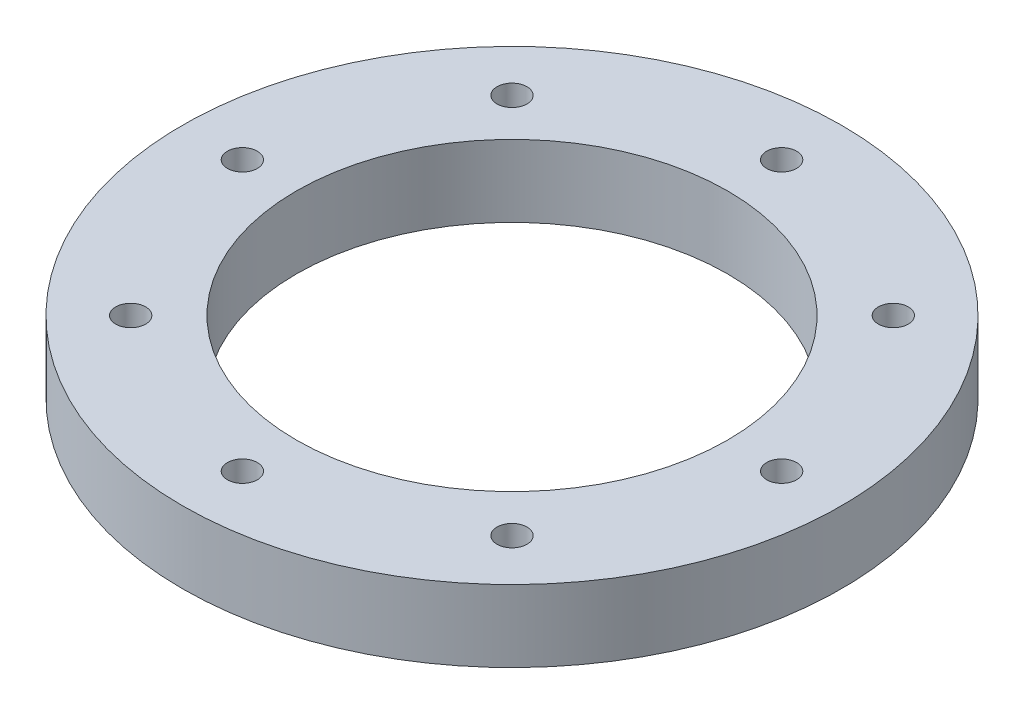
ISO-10303-21;
HEADER;
FILE_DESCRIPTION(('STEP AP214'),'2;1');
FILE_NAME('part.step','',(''),(''),'','','');
FILE_SCHEMA(('AUTOMOTIVE_DESIGN { 1 0 10303 214 1 1 1 1 }'));
ENDSEC;
DATA;
#1=APPLICATION_CONTEXT('core data for automotive mechanical design processes');
#2=APPLICATION_PROTOCOL_DEFINITION('international standard','automotive_design',2000,#1);
#3=PRODUCT_CONTEXT('',#1,'mechanical');
#4=PRODUCT('Part','Part','',(#3));
#5=PRODUCT_RELATED_PRODUCT_CATEGORY('part','',(#4));
#6=PRODUCT_DEFINITION_FORMATION('','',#4);
#7=PRODUCT_DEFINITION_CONTEXT('part definition',#1,'design');
#8=PRODUCT_DEFINITION('design','',#6,#7);
#9=PRODUCT_DEFINITION_SHAPE('','',#8);
#10=(LENGTH_UNIT() NAMED_UNIT(*) SI_UNIT(.MILLI.,.METRE.));
#11=(NAMED_UNIT(*) PLANE_ANGLE_UNIT() SI_UNIT($,.RADIAN.));
#12=(NAMED_UNIT(*) SI_UNIT($,.STERADIAN.) SOLID_ANGLE_UNIT());
#13=UNCERTAINTY_MEASURE_WITH_UNIT(LENGTH_MEASURE(1.E-05),#10,'distance_accuracy_value','');
#14=(GEOMETRIC_REPRESENTATION_CONTEXT(3) GLOBAL_UNCERTAINTY_ASSIGNED_CONTEXT((#13)) GLOBAL_UNIT_ASSIGNED_CONTEXT((#10,
#11,#12)) REPRESENTATION_CONTEXT('',''));
#15=CARTESIAN_POINT('',(0.,0.,0.));
#16=DIRECTION('',(0.,0.,1.));
#17=DIRECTION('',(1.,0.,0.));
#18=AXIS2_PLACEMENT_3D('',#15,#16,#17);
#19=CARTESIAN_POINT('',(31.8198051533946,0.,-31.8198051533947));
#20=DIRECTION('',(0.,1.,0.));
#21=DIRECTION('',(0.,0.,1.));
#22=AXIS2_PLACEMENT_3D('',#19,#20,#21);
#23=CYLINDRICAL_SURFACE('',#22,1.7);
#24=CARTESIAN_POINT('',(31.8198051533946,0.,-31.8198051533947));
#25=DIRECTION('',(0.,1.,0.));
#26=DIRECTION('',(0.707106781186549,0.,0.707106781186546));
#27=AXIS2_PLACEMENT_3D('',#24,#25,#26);
#28=CIRCLE('',#27,1.7);
#29=CARTESIAN_POINT('',(33.0218866814117,0.,-30.6177236253776));
#30=VERTEX_POINT('',#29);
#31=EDGE_CURVE('E116',#30,#30,#28,.T.);
#32=ORIENTED_EDGE('',*,*,#31,.F.);
#33=EDGE_LOOP('',(#32));
#34=FACE_BOUND('',#33,.T.);
#35=CARTESIAN_POINT('',(31.8198051533946,7.,-31.8198051533947));
#36=DIRECTION('',(0.,1.,0.));
#37=DIRECTION('',(0.,0.,1.));
#38=AXIS2_PLACEMENT_3D('',#35,#36,#37);
#39=CIRCLE('',#38,1.7);
#40=CARTESIAN_POINT('',(31.8198051533946,7.,-30.1198051533947));
#41=VERTEX_POINT('',#40);
#42=EDGE_CURVE('E47',#41,#41,#39,.F.);
#43=ORIENTED_EDGE('',*,*,#42,.F.);
#44=EDGE_LOOP('',(#43));
#45=FACE_BOUND('',#44,.T.);
#46=ADVANCED_FACE('F43',(#34,#45),#23,.F.);
#47=CARTESIAN_POINT('',(31.819805153395,0.,31.8198051533942));
#48=DIRECTION('',(0.,1.,0.));
#49=DIRECTION('',(0.,0.,1.));
#50=AXIS2_PLACEMENT_3D('',#47,#48,#49);
#51=CYLINDRICAL_SURFACE('',#50,1.7);
#52=CARTESIAN_POINT('',(31.819805153395,0.,31.8198051533942));
#53=DIRECTION('',(0.,1.,0.));
#54=DIRECTION('',(-0.707106781186539,0.,0.707106781186556));
#55=AXIS2_PLACEMENT_3D('',#52,#53,#54);
#56=CIRCLE('',#55,1.7);
#57=CARTESIAN_POINT('',(30.6177236253779,0.,33.0218866814114));
#58=VERTEX_POINT('',#57);
#59=EDGE_CURVE('E97',#58,#58,#56,.T.);
#60=ORIENTED_EDGE('',*,*,#59,.F.);
#61=EDGE_LOOP('',(#60));
#62=FACE_BOUND('',#61,.T.);
#63=CARTESIAN_POINT('',(31.819805153395,7.,31.8198051533942));
#64=DIRECTION('',(0.,1.,0.));
#65=DIRECTION('',(0.,0.,1.));
#66=AXIS2_PLACEMENT_3D('',#63,#64,#65);
#67=CIRCLE('',#66,1.7);
#68=CARTESIAN_POINT('',(31.819805153395,7.,33.5198051533943));
#69=VERTEX_POINT('',#68);
#70=EDGE_CURVE('E90',#69,#69,#67,.F.);
#71=ORIENTED_EDGE('',*,*,#70,.F.);
#72=EDGE_LOOP('',(#71));
#73=FACE_BOUND('',#72,.T.);
#74=ADVANCED_FACE('F166',(#62,#73),#51,.F.);
#75=CARTESIAN_POINT('',(4.71349980743823E-13,0.,45.));
#76=DIRECTION('',(0.,1.,0.));
#77=DIRECTION('',(0.,0.,1.));
#78=AXIS2_PLACEMENT_3D('',#75,#76,#77);
#79=CYLINDRICAL_SURFACE('',#78,1.7);
#80=CARTESIAN_POINT('',(4.71349980743823E-13,0.,45.));
#81=DIRECTION('',(0.,1.,0.));
#82=DIRECTION('',(-1.,0.,0.));
#83=AXIS2_PLACEMENT_3D('',#80,#81,#82);
#84=CIRCLE('',#83,1.7);
#85=CARTESIAN_POINT('',(-1.69999999999953,0.,45.));
#86=VERTEX_POINT('',#85);
#87=EDGE_CURVE('E102',#86,#86,#84,.T.);
#88=ORIENTED_EDGE('',*,*,#87,.F.);
#89=EDGE_LOOP('',(#88));
#90=FACE_BOUND('',#89,.T.);
#91=CARTESIAN_POINT('',(4.71349980743823E-13,7.,45.));
#92=DIRECTION('',(0.,1.,0.));
#93=DIRECTION('',(0.,0.,1.));
#94=AXIS2_PLACEMENT_3D('',#91,#92,#93);
#95=CIRCLE('',#94,1.7);
#96=CARTESIAN_POINT('',(4.71349980743823E-13,7.,46.7));
#97=VERTEX_POINT('',#96);
#98=EDGE_CURVE('E87',#97,#97,#95,.F.);
#99=ORIENTED_EDGE('',*,*,#98,.F.);
#100=EDGE_LOOP('',(#99));
#101=FACE_BOUND('',#100,.T.);
#102=ADVANCED_FACE('F173',(#90,#101),#79,.F.);
#103=CARTESIAN_POINT('',(-31.8198051533944,0.,31.8198051533949));
#104=DIRECTION('',(0.,1.,0.));
#105=DIRECTION('',(0.,0.,1.));
#106=AXIS2_PLACEMENT_3D('',#103,#104,#105);
#107=CYLINDRICAL_SURFACE('',#106,1.7);
#108=CARTESIAN_POINT('',(-31.8198051533944,0.,31.8198051533949));
#109=DIRECTION('',(0.,1.,0.));
#110=DIRECTION('',(-0.707106781186554,0.,-0.707106781186541));
#111=AXIS2_PLACEMENT_3D('',#108,#109,#110);
#112=CIRCLE('',#111,1.7);
#113=CARTESIAN_POINT('',(-33.0218866814115,0.,30.6177236253778));
#114=VERTEX_POINT('',#113);
#115=EDGE_CURVE('E108',#114,#114,#112,.T.);
#116=ORIENTED_EDGE('',*,*,#115,.F.);
#117=EDGE_LOOP('',(#116));
#118=FACE_BOUND('',#117,.T.);
#119=CARTESIAN_POINT('',(-31.8198051533944,7.,31.8198051533949));
#120=DIRECTION('',(0.,1.,0.));
#121=DIRECTION('',(0.,0.,1.));
#122=AXIS2_PLACEMENT_3D('',#119,#120,#121);
#123=CIRCLE('',#122,1.7);
#124=CARTESIAN_POINT('',(-31.8198051533944,7.,33.5198051533949));
#125=VERTEX_POINT('',#124);
#126=EDGE_CURVE('E83',#125,#125,#123,.F.);
#127=ORIENTED_EDGE('',*,*,#126,.F.);
#128=EDGE_LOOP('',(#127));
#129=FACE_BOUND('',#128,.T.);
#130=ADVANCED_FACE('F179',(#118,#129),#107,.F.);
#131=CARTESIAN_POINT('',(-45.,0.,0.));
#132=DIRECTION('',(0.,1.,0.));
#133=DIRECTION('',(0.,0.,1.));
#134=AXIS2_PLACEMENT_3D('',#131,#132,#133);
#135=CYLINDRICAL_SURFACE('',#134,1.7);
#136=CARTESIAN_POINT('',(-45.,0.,0.));
#137=DIRECTION('',(0.,1.,0.));
#138=DIRECTION('',(0.,0.,-1.));
#139=AXIS2_PLACEMENT_3D('',#136,#137,#138);
#140=CIRCLE('',#139,1.7);
#141=CARTESIAN_POINT('',(-45.,0.,-1.7));
#142=VERTEX_POINT('',#141);
#143=EDGE_CURVE('E121',#142,#142,#140,.T.);
#144=ORIENTED_EDGE('',*,*,#143,.F.);
#145=EDGE_LOOP('',(#144));
#146=FACE_BOUND('',#145,.T.);
#147=CARTESIAN_POINT('',(-45.,7.,0.));
#148=DIRECTION('',(0.,1.,0.));
#149=DIRECTION('',(0.,0.,1.));
#150=AXIS2_PLACEMENT_3D('',#147,#148,#149);
#151=CIRCLE('',#150,1.7);
#152=CARTESIAN_POINT('',(-45.,7.,1.7));
#153=VERTEX_POINT('',#152);
#154=EDGE_CURVE('E79',#153,#153,#151,.F.);
#155=ORIENTED_EDGE('',*,*,#154,.F.);
#156=EDGE_LOOP('',(#155));
#157=FACE_BOUND('',#156,.T.);
#158=ADVANCED_FACE('F284',(#146,#157),#135,.F.);
#159=CARTESIAN_POINT('',(-31.8198051533948,0.,-31.8198051533945));
#160=DIRECTION('',(0.,1.,0.));
#161=DIRECTION('',(0.,0.,1.));
#162=AXIS2_PLACEMENT_3D('',#159,#160,#161);
#163=CYLINDRICAL_SURFACE('',#162,1.7);
#164=CARTESIAN_POINT('',(-31.8198051533948,0.,-31.8198051533945));
#165=DIRECTION('',(0.,1.,0.));
#166=DIRECTION('',(0.707106781186544,0.,-0.707106781186551));
#167=AXIS2_PLACEMENT_3D('',#164,#165,#166);
#168=CIRCLE('',#167,1.7);
#169=CARTESIAN_POINT('',(-30.6177236253777,0.,-33.0218866814116));
#170=VERTEX_POINT('',#169);
#171=EDGE_CURVE('E117',#170,#170,#168,.T.);
#172=ORIENTED_EDGE('',*,*,#171,.F.);
#173=EDGE_LOOP('',(#172));
#174=FACE_BOUND('',#173,.T.);
#175=CARTESIAN_POINT('',(-31.8198051533948,7.,-31.8198051533945));
#176=DIRECTION('',(0.,1.,0.));
#177=DIRECTION('',(0.,0.,1.));
#178=AXIS2_PLACEMENT_3D('',#175,#176,#177);
#179=CIRCLE('',#178,1.7);
#180=CARTESIAN_POINT('',(-31.8198051533948,7.,-30.1198051533945));
#181=VERTEX_POINT('',#180);
#182=EDGE_CURVE('E74',#181,#181,#179,.F.);
#183=ORIENTED_EDGE('',*,*,#182,.F.);
#184=EDGE_LOOP('',(#183));
#185=FACE_BOUND('',#184,.T.);
#186=ADVANCED_FACE('F193',(#174,#185),#163,.F.);
#187=CARTESIAN_POINT('',(-1.57116660247941E-13,0.,-45.));
#188=DIRECTION('',(0.,1.,0.));
#189=DIRECTION('',(0.,0.,1.));
#190=AXIS2_PLACEMENT_3D('',#187,#188,#189);
#191=CYLINDRICAL_SURFACE('',#190,1.7);
#192=CARTESIAN_POINT('',(-1.57116660247941E-13,0.,-45.));
#193=DIRECTION('',(0.,1.,0.));
#194=DIRECTION('',(1.,0.,0.));
#195=AXIS2_PLACEMENT_3D('',#192,#193,#194);
#196=CIRCLE('',#195,1.7);
#197=CARTESIAN_POINT('',(1.69999999999984,0.,-45.));
#198=VERTEX_POINT('',#197);
#199=EDGE_CURVE('E112',#198,#198,#196,.T.);
#200=ORIENTED_EDGE('',*,*,#199,.F.);
#201=EDGE_LOOP('',(#200));
#202=FACE_BOUND('',#201,.T.);
#203=CARTESIAN_POINT('',(-1.57116660247941E-13,7.,-45.));
#204=DIRECTION('',(0.,1.,0.));
#205=DIRECTION('',(0.,0.,1.));
#206=AXIS2_PLACEMENT_3D('',#203,#204,#205);
#207=CIRCLE('',#206,1.7);
#208=CARTESIAN_POINT('',(-1.57116660247941E-13,7.,-43.3));
#209=VERTEX_POINT('',#208);
#210=EDGE_CURVE('E70',#209,#209,#207,.F.);
#211=ORIENTED_EDGE('',*,*,#210,.F.);
#212=EDGE_LOOP('',(#211));
#213=FACE_BOUND('',#212,.T.);
#214=ADVANCED_FACE('F186',(#202,#213),#191,.F.);
#215=CARTESIAN_POINT('',(45.,0.,0.));
#216=DIRECTION('',(0.,1.,0.));
#217=DIRECTION('',(0.,0.,1.));
#218=AXIS2_PLACEMENT_3D('',#215,#216,#217);
#219=CYLINDRICAL_SURFACE('',#218,1.7);
#220=CARTESIAN_POINT('',(45.,0.,0.));
#221=DIRECTION('',(0.,1.,0.));
#222=DIRECTION('',(0.,0.,1.));
#223=AXIS2_PLACEMENT_3D('',#220,#221,#222);
#224=CIRCLE('',#223,1.7);
#225=CARTESIAN_POINT('',(45.,0.,1.7));
#226=VERTEX_POINT('',#225);
#227=EDGE_CURVE('E68',#226,#226,#224,.T.);
#228=ORIENTED_EDGE('',*,*,#227,.F.);
#229=EDGE_LOOP('',(#228));
#230=FACE_BOUND('',#229,.T.);
#231=CARTESIAN_POINT('',(45.,7.,0.));
#232=DIRECTION('',(0.,1.,0.));
#233=DIRECTION('',(0.,0.,1.));
#234=AXIS2_PLACEMENT_3D('',#231,#232,#233);
#235=CIRCLE('',#234,1.7);
#236=CARTESIAN_POINT('',(45.,7.,1.7));
#237=VERTEX_POINT('',#236);
#238=EDGE_CURVE('E64',#237,#237,#235,.F.);
#239=ORIENTED_EDGE('',*,*,#238,.F.);
#240=EDGE_LOOP('',(#239));
#241=FACE_BOUND('',#240,.T.);
#242=ADVANCED_FACE('F184',(#230,#241),#219,.F.);
#243=CARTESIAN_POINT('',(0.,12.,0.));
#244=DIRECTION('',(0.,1.,0.));
#245=DIRECTION('',(0.,0.,1.));
#246=AXIS2_PLACEMENT_3D('',#243,#244,#245);
#247=PLANE('',#246);
#248=CARTESIAN_POINT('',(-1.57116660247941E-13,12.,-45.));
#249=DIRECTION('',(0.,1.,0.));
#250=DIRECTION('',(1.,0.,0.));
#251=AXIS2_PLACEMENT_3D('',#248,#249,#250);
#252=CIRCLE('',#251,2.5);
#253=CARTESIAN_POINT('',(2.49999999999985,12.,-45.));
#254=VERTEX_POINT('',#253);
#255=EDGE_CURVE('E470',#254,#254,#252,.T.);
#256=ORIENTED_EDGE('',*,*,#255,.F.);
#257=EDGE_LOOP('',(#256));
#258=FACE_BOUND('',#257,.T.);
#259=CARTESIAN_POINT('',(-31.8198051533948,12.,-31.8198051533945));
#260=DIRECTION('',(0.,1.,0.));
#261=DIRECTION('',(0.707106781186544,0.,-0.707106781186551));
#262=AXIS2_PLACEMENT_3D('',#259,#260,#261);
#263=CIRCLE('',#262,2.5);
#264=CARTESIAN_POINT('',(-30.0520382004284,12.,-33.5875721063608));
#265=VERTEX_POINT('',#264);
#266=EDGE_CURVE('E490',#265,#265,#263,.T.);
#267=ORIENTED_EDGE('',*,*,#266,.F.);
#268=EDGE_LOOP('',(#267));
#269=FACE_BOUND('',#268,.T.);
#270=CARTESIAN_POINT('',(-45.,12.,0.));
#271=DIRECTION('',(0.,1.,0.));
#272=DIRECTION('',(0.,0.,-1.));
#273=AXIS2_PLACEMENT_3D('',#270,#271,#272);
#274=CIRCLE('',#273,2.5);
#275=CARTESIAN_POINT('',(-45.,12.,-2.5));
#276=VERTEX_POINT('',#275);
#277=EDGE_CURVE('E482',#276,#276,#274,.T.);
#278=ORIENTED_EDGE('',*,*,#277,.F.);
#279=EDGE_LOOP('',(#278));
#280=FACE_BOUND('',#279,.T.);
#281=CARTESIAN_POINT('',(-31.8198051533944,12.,31.8198051533949));
#282=DIRECTION('',(0.,1.,0.));
#283=DIRECTION('',(-0.707106781186554,0.,-0.707106781186541));
#284=AXIS2_PLACEMENT_3D('',#281,#282,#283);
#285=CIRCLE('',#284,2.5);
#286=CARTESIAN_POINT('',(-33.5875721063607,12.,30.0520382004286));
#287=VERTEX_POINT('',#286);
#288=EDGE_CURVE('E473',#287,#287,#285,.T.);
#289=ORIENTED_EDGE('',*,*,#288,.F.);
#290=EDGE_LOOP('',(#289));
#291=FACE_BOUND('',#290,.T.);
#292=CARTESIAN_POINT('',(4.71349980743823E-13,12.,45.));
#293=DIRECTION('',(0.,1.,0.));
#294=DIRECTION('',(-1.,0.,0.));
#295=AXIS2_PLACEMENT_3D('',#292,#293,#294);
#296=CIRCLE('',#295,2.5);
#297=CARTESIAN_POINT('',(-2.49999999999953,12.,45.));
#298=VERTEX_POINT('',#297);
#299=EDGE_CURVE('E509',#298,#298,#296,.T.);
#300=ORIENTED_EDGE('',*,*,#299,.F.);
#301=EDGE_LOOP('',(#300));
#302=FACE_BOUND('',#301,.T.);
#303=CARTESIAN_POINT('',(31.819805153395,12.,31.8198051533942));
#304=DIRECTION('',(0.,1.,0.));
#305=DIRECTION('',(-0.707106781186539,0.,0.707106781186556));
#306=AXIS2_PLACEMENT_3D('',#303,#304,#305);
#307=CIRCLE('',#306,2.5);
#308=CARTESIAN_POINT('',(30.0520382004287,12.,33.5875721063606));
#309=VERTEX_POINT('',#308);
#310=EDGE_CURVE('E501',#309,#309,#307,.T.);
#311=ORIENTED_EDGE('',*,*,#310,.F.);
#312=EDGE_LOOP('',(#311));
#313=FACE_BOUND('',#312,.T.);
#314=CARTESIAN_POINT('',(31.8198051533946,12.,-31.8198051533947));
#315=DIRECTION('',(0.,1.,0.));
#316=DIRECTION('',(0.707106781186549,0.,0.707106781186546));
#317=AXIS2_PLACEMENT_3D('',#314,#315,#316);
#318=CIRCLE('',#317,2.5);
#319=CARTESIAN_POINT('',(33.587572106361,12.,-30.0520382004283));
#320=VERTEX_POINT('',#319);
#321=EDGE_CURVE('E462',#320,#320,#318,.T.);
#322=ORIENTED_EDGE('',*,*,#321,.F.);
#323=EDGE_LOOP('',(#322));
#324=FACE_BOUND('',#323,.T.);
#325=CARTESIAN_POINT('',(45.,12.,0.));
#326=DIRECTION('',(0.,1.,0.));
#327=DIRECTION('',(0.,0.,1.));
#328=AXIS2_PLACEMENT_3D('',#325,#326,#327);
#329=CIRCLE('',#328,2.5);
#330=CARTESIAN_POINT('',(45.,12.,2.5));
#331=VERTEX_POINT('',#330);
#332=EDGE_CURVE('E131',#331,#331,#329,.T.);
#333=ORIENTED_EDGE('',*,*,#332,.F.);
#334=EDGE_LOOP('',(#333));
#335=FACE_BOUND('',#334,.T.);
#336=CARTESIAN_POINT('',(0.,12.,0.));
#337=DIRECTION('',(0.,1.,0.));
#338=DIRECTION('',(0.,0.,1.));
#339=AXIS2_PLACEMENT_3D('',#336,#337,#338);
#340=CIRCLE('',#339,55.);
#341=CARTESIAN_POINT('',(0.,12.,55.));
#342=VERTEX_POINT('',#341);
#343=EDGE_CURVE('E10',#342,#342,#340,.T.);
#344=ORIENTED_EDGE('',*,*,#343,.T.);
#345=EDGE_LOOP('',(#344));
#346=FACE_BOUND('',#345,.T.);
#347=CARTESIAN_POINT('',(0.,12.,0.));
#348=DIRECTION('',(0.,1.,0.));
#349=DIRECTION('',(0.,0.,1.));
#350=AXIS2_PLACEMENT_3D('',#347,#348,#349);
#351=CIRCLE('',#350,36.);
#352=CARTESIAN_POINT('',(0.,12.,36.));
#353=VERTEX_POINT('',#352);
#354=EDGE_CURVE('E58',#353,#353,#351,.T.);
#355=ORIENTED_EDGE('',*,*,#354,.F.);
#356=EDGE_LOOP('',(#355));
#357=FACE_BOUND('',#356,.T.);
#358=ADVANCED_FACE('F185',(#258,#269,#280,#291,#302,#313,#324,#335,#346,#357),#247,.T.);
#359=CARTESIAN_POINT('',(0.,0.,0.));
#360=DIRECTION('',(0.,1.,0.));
#361=DIRECTION('',(0.,0.,1.));
#362=AXIS2_PLACEMENT_3D('',#359,#360,#361);
#363=PLANE('',#362);
#364=ORIENTED_EDGE('',*,*,#199,.T.);
#365=EDGE_LOOP('',(#364));
#366=FACE_BOUND('',#365,.T.);
#367=ORIENTED_EDGE('',*,*,#171,.T.);
#368=EDGE_LOOP('',(#367));
#369=FACE_BOUND('',#368,.T.);
#370=ORIENTED_EDGE('',*,*,#143,.T.);
#371=EDGE_LOOP('',(#370));
#372=FACE_BOUND('',#371,.T.);
#373=ORIENTED_EDGE('',*,*,#115,.T.);
#374=EDGE_LOOP('',(#373));
#375=FACE_BOUND('',#374,.T.);
#376=ORIENTED_EDGE('',*,*,#87,.T.);
#377=EDGE_LOOP('',(#376));
#378=FACE_BOUND('',#377,.T.);
#379=ORIENTED_EDGE('',*,*,#59,.T.);
#380=EDGE_LOOP('',(#379));
#381=FACE_BOUND('',#380,.T.);
#382=ORIENTED_EDGE('',*,*,#31,.T.);
#383=EDGE_LOOP('',(#382));
#384=FACE_BOUND('',#383,.T.);
#385=ORIENTED_EDGE('',*,*,#227,.T.);
#386=EDGE_LOOP('',(#385));
#387=FACE_BOUND('',#386,.T.);
#388=CARTESIAN_POINT('',(0.,0.,0.));
#389=DIRECTION('',(0.,1.,0.));
#390=DIRECTION('',(0.,0.,1.));
#391=AXIS2_PLACEMENT_3D('',#388,#389,#390);
#392=CIRCLE('',#391,55.);
#393=CARTESIAN_POINT('',(0.,0.,55.));
#394=VERTEX_POINT('',#393);
#395=EDGE_CURVE('E52',#394,#394,#392,.T.);
#396=ORIENTED_EDGE('',*,*,#395,.F.);
#397=EDGE_LOOP('',(#396));
#398=FACE_BOUND('',#397,.T.);
#399=CARTESIAN_POINT('',(0.,0.,0.));
#400=DIRECTION('',(0.,1.,0.));
#401=DIRECTION('',(0.,0.,1.));
#402=AXIS2_PLACEMENT_3D('',#399,#400,#401);
#403=CIRCLE('',#402,36.);
#404=CARTESIAN_POINT('',(0.,0.,36.));
#405=VERTEX_POINT('',#404);
#406=EDGE_CURVE('E61',#405,#405,#403,.T.);
#407=ORIENTED_EDGE('',*,*,#406,.T.);
#408=EDGE_LOOP('',(#407));
#409=FACE_BOUND('',#408,.T.);
#410=ADVANCED_FACE('F148',(#366,#369,#372,#375,#378,#381,#384,#387,#398,#409),#363,.F.);
#411=CARTESIAN_POINT('',(0.,12.,0.));
#412=DIRECTION('',(0.,-1.,0.));
#413=DIRECTION('',(0.,0.,-1.));
#414=AXIS2_PLACEMENT_3D('',#411,#412,#413);
#415=CYLINDRICAL_SURFACE('',#414,55.);
#416=ORIENTED_EDGE('',*,*,#343,.F.);
#417=EDGE_LOOP('',(#416));
#418=FACE_BOUND('',#417,.T.);
#419=ORIENTED_EDGE('',*,*,#395,.T.);
#420=EDGE_LOOP('',(#419));
#421=FACE_BOUND('',#420,.T.);
#422=ADVANCED_FACE('F45',(#418,#421),#415,.T.);
#423=CARTESIAN_POINT('',(0.,12.,0.));
#424=DIRECTION('',(0.,-1.,0.));
#425=DIRECTION('',(0.,0.,-1.));
#426=AXIS2_PLACEMENT_3D('',#423,#424,#425);
#427=CYLINDRICAL_SURFACE('',#426,36.);
#428=ORIENTED_EDGE('',*,*,#354,.T.);
#429=EDGE_LOOP('',(#428));
#430=FACE_BOUND('',#429,.T.);
#431=ORIENTED_EDGE('',*,*,#406,.F.);
#432=EDGE_LOOP('',(#431));
#433=FACE_BOUND('',#432,.T.);
#434=ADVANCED_FACE('F150',(#430,#433),#427,.F.);
#435=CARTESIAN_POINT('',(45.,7.,0.));
#436=DIRECTION('',(0.,1.,0.));
#437=DIRECTION('',(0.,0.,1.));
#438=AXIS2_PLACEMENT_3D('',#435,#436,#437);
#439=PLANE('',#438);
#440=CARTESIAN_POINT('',(45.,7.,0.));
#441=DIRECTION('',(0.,1.,0.));
#442=DIRECTION('',(0.,0.,1.));
#443=AXIS2_PLACEMENT_3D('',#440,#441,#442);
#444=CIRCLE('',#443,2.5);
#445=CARTESIAN_POINT('',(45.,7.,2.5));
#446=VERTEX_POINT('',#445);
#447=EDGE_CURVE('E69',#446,#446,#444,.T.);
#448=ORIENTED_EDGE('',*,*,#447,.T.);
#449=EDGE_LOOP('',(#448));
#450=FACE_BOUND('',#449,.T.);
#451=ORIENTED_EDGE('',*,*,#238,.T.);
#452=EDGE_LOOP('',(#451));
#453=FACE_BOUND('',#452,.T.);
#454=ADVANCED_FACE('F152',(#450,#453),#439,.T.);
#455=CARTESIAN_POINT('',(45.,7.,0.));
#456=DIRECTION('',(0.,1.,0.));
#457=DIRECTION('',(0.,0.,1.));
#458=AXIS2_PLACEMENT_3D('',#455,#456,#457);
#459=CYLINDRICAL_SURFACE('',#458,2.5);
#460=ORIENTED_EDGE('',*,*,#447,.F.);
#461=EDGE_LOOP('',(#460));
#462=FACE_BOUND('',#461,.T.);
#463=ORIENTED_EDGE('',*,*,#332,.T.);
#464=EDGE_LOOP('',(#463));
#465=FACE_BOUND('',#464,.T.);
#466=ADVANCED_FACE('F159',(#462,#465),#459,.F.);
#467=CARTESIAN_POINT('',(-1.57116660247941E-13,7.,-45.));
#468=DIRECTION('',(0.,1.,0.));
#469=DIRECTION('',(1.,0.,0.));
#470=AXIS2_PLACEMENT_3D('',#467,#468,#469);
#471=PLANE('',#470);
#472=CARTESIAN_POINT('',(-1.57116660247941E-13,7.,-45.));
#473=DIRECTION('',(0.,1.,0.));
#474=DIRECTION('',(1.,0.,0.));
#475=AXIS2_PLACEMENT_3D('',#472,#473,#474);
#476=CIRCLE('',#475,2.5);
#477=CARTESIAN_POINT('',(2.49999999999985,7.,-45.));
#478=VERTEX_POINT('',#477);
#479=EDGE_CURVE('E465',#478,#478,#476,.T.);
#480=ORIENTED_EDGE('',*,*,#479,.T.);
#481=EDGE_LOOP('',(#480));
#482=FACE_BOUND('',#481,.T.);
#483=ORIENTED_EDGE('',*,*,#210,.T.);
#484=EDGE_LOOP('',(#483));
#485=FACE_BOUND('',#484,.T.);
#486=ADVANCED_FACE('F182',(#482,#485),#471,.T.);
#487=CARTESIAN_POINT('',(-1.57116660247941E-13,7.,-45.));
#488=DIRECTION('',(0.,1.,0.));
#489=DIRECTION('',(0.,0.,1.));
#490=AXIS2_PLACEMENT_3D('',#487,#488,#489);
#491=CYLINDRICAL_SURFACE('',#490,2.5);
#492=ORIENTED_EDGE('',*,*,#479,.F.);
#493=EDGE_LOOP('',(#492));
#494=FACE_BOUND('',#493,.T.);
#495=ORIENTED_EDGE('',*,*,#255,.T.);
#496=EDGE_LOOP('',(#495));
#497=FACE_BOUND('',#496,.T.);
#498=ADVANCED_FACE('F252',(#494,#497),#491,.F.);
#499=CARTESIAN_POINT('',(-31.8198051533948,7.,-31.8198051533945));
#500=DIRECTION('',(0.,1.,0.));
#501=DIRECTION('',(0.707106781186544,0.,-0.707106781186551));
#502=AXIS2_PLACEMENT_3D('',#499,#500,#501);
#503=PLANE('',#502);
#504=CARTESIAN_POINT('',(-31.8198051533948,7.,-31.8198051533945));
#505=DIRECTION('',(0.,1.,0.));
#506=DIRECTION('',(0.707106781186544,0.,-0.707106781186551));
#507=AXIS2_PLACEMENT_3D('',#504,#505,#506);
#508=CIRCLE('',#507,2.5);
#509=CARTESIAN_POINT('',(-30.0520382004284,7.,-33.5875721063608));
#510=VERTEX_POINT('',#509);
#511=EDGE_CURVE('E494',#510,#510,#508,.T.);
#512=ORIENTED_EDGE('',*,*,#511,.T.);
#513=EDGE_LOOP('',(#512));
#514=FACE_BOUND('',#513,.T.);
#515=ORIENTED_EDGE('',*,*,#182,.T.);
#516=EDGE_LOOP('',(#515));
#517=FACE_BOUND('',#516,.T.);
#518=ADVANCED_FACE('F256',(#514,#517),#503,.T.);
#519=CARTESIAN_POINT('',(-31.8198051533948,7.,-31.8198051533945));
#520=DIRECTION('',(0.,1.,0.));
#521=DIRECTION('',(0.,0.,1.));
#522=AXIS2_PLACEMENT_3D('',#519,#520,#521);
#523=CYLINDRICAL_SURFACE('',#522,2.5);
#524=ORIENTED_EDGE('',*,*,#511,.F.);
#525=EDGE_LOOP('',(#524));
#526=FACE_BOUND('',#525,.T.);
#527=ORIENTED_EDGE('',*,*,#266,.T.);
#528=EDGE_LOOP('',(#527));
#529=FACE_BOUND('',#528,.T.);
#530=ADVANCED_FACE('F260',(#526,#529),#523,.F.);
#531=CARTESIAN_POINT('',(-45.,7.,0.));
#532=DIRECTION('',(0.,1.,0.));
#533=DIRECTION('',(0.,0.,-1.));
#534=AXIS2_PLACEMENT_3D('',#531,#532,#533);
#535=PLANE('',#534);
#536=CARTESIAN_POINT('',(-45.,7.,0.));
#537=DIRECTION('',(0.,1.,0.));
#538=DIRECTION('',(0.,0.,-1.));
#539=AXIS2_PLACEMENT_3D('',#536,#537,#538);
#540=CIRCLE('',#539,2.5);
#541=CARTESIAN_POINT('',(-45.,7.,-2.5));
#542=VERTEX_POINT('',#541);
#543=EDGE_CURVE('E486',#542,#542,#540,.T.);
#544=ORIENTED_EDGE('',*,*,#543,.T.);
#545=EDGE_LOOP('',(#544));
#546=FACE_BOUND('',#545,.T.);
#547=ORIENTED_EDGE('',*,*,#154,.T.);
#548=EDGE_LOOP('',(#547));
#549=FACE_BOUND('',#548,.T.);
#550=ADVANCED_FACE('F264',(#546,#549),#535,.T.);
#551=CARTESIAN_POINT('',(-45.,7.,0.));
#552=DIRECTION('',(0.,1.,0.));
#553=DIRECTION('',(0.,0.,1.));
#554=AXIS2_PLACEMENT_3D('',#551,#552,#553);
#555=CYLINDRICAL_SURFACE('',#554,2.5);
#556=ORIENTED_EDGE('',*,*,#543,.F.);
#557=EDGE_LOOP('',(#556));
#558=FACE_BOUND('',#557,.T.);
#559=ORIENTED_EDGE('',*,*,#277,.T.);
#560=EDGE_LOOP('',(#559));
#561=FACE_BOUND('',#560,.T.);
#562=ADVANCED_FACE('F268',(#558,#561),#555,.F.);
#563=CARTESIAN_POINT('',(-31.8198051533944,7.,31.8198051533949));
#564=DIRECTION('',(0.,1.,0.));
#565=DIRECTION('',(-0.707106781186554,0.,-0.707106781186541));
#566=AXIS2_PLACEMENT_3D('',#563,#564,#565);
#567=PLANE('',#566);
#568=CARTESIAN_POINT('',(-31.8198051533944,7.,31.8198051533949));
#569=DIRECTION('',(0.,1.,0.));
#570=DIRECTION('',(-0.707106781186554,0.,-0.707106781186541));
#571=AXIS2_PLACEMENT_3D('',#568,#569,#570);
#572=CIRCLE('',#571,2.5);
#573=CARTESIAN_POINT('',(-33.5875721063607,7.,30.0520382004286));
#574=VERTEX_POINT('',#573);
#575=EDGE_CURVE('E477',#574,#574,#572,.T.);
#576=ORIENTED_EDGE('',*,*,#575,.T.);
#577=EDGE_LOOP('',(#576));
#578=FACE_BOUND('',#577,.T.);
#579=ORIENTED_EDGE('',*,*,#126,.T.);
#580=EDGE_LOOP('',(#579));
#581=FACE_BOUND('',#580,.T.);
#582=ADVANCED_FACE('F238',(#578,#581),#567,.T.);
#583=CARTESIAN_POINT('',(-31.8198051533944,7.,31.8198051533949));
#584=DIRECTION('',(0.,1.,0.));
#585=DIRECTION('',(0.,0.,1.));
#586=AXIS2_PLACEMENT_3D('',#583,#584,#585);
#587=CYLINDRICAL_SURFACE('',#586,2.5);
#588=ORIENTED_EDGE('',*,*,#575,.F.);
#589=EDGE_LOOP('',(#588));
#590=FACE_BOUND('',#589,.T.);
#591=ORIENTED_EDGE('',*,*,#288,.T.);
#592=EDGE_LOOP('',(#591));
#593=FACE_BOUND('',#592,.T.);
#594=ADVANCED_FACE('F228',(#590,#593),#587,.F.);
#595=CARTESIAN_POINT('',(4.71349980743823E-13,7.,45.));
#596=DIRECTION('',(0.,1.,0.));
#597=DIRECTION('',(-1.,0.,0.));
#598=AXIS2_PLACEMENT_3D('',#595,#596,#597);
#599=PLANE('',#598);
#600=CARTESIAN_POINT('',(4.71349980743823E-13,7.,45.));
#601=DIRECTION('',(0.,1.,0.));
#602=DIRECTION('',(-1.,0.,0.));
#603=AXIS2_PLACEMENT_3D('',#600,#601,#602);
#604=CIRCLE('',#603,2.5);
#605=CARTESIAN_POINT('',(-2.49999999999953,7.,45.));
#606=VERTEX_POINT('',#605);
#607=EDGE_CURVE('E478',#606,#606,#604,.T.);
#608=ORIENTED_EDGE('',*,*,#607,.T.);
#609=EDGE_LOOP('',(#608));
#610=FACE_BOUND('',#609,.T.);
#611=ORIENTED_EDGE('',*,*,#98,.T.);
#612=EDGE_LOOP('',(#611));
#613=FACE_BOUND('',#612,.T.);
#614=ADVANCED_FACE('F225',(#610,#613),#599,.T.);
#615=CARTESIAN_POINT('',(4.71349980743823E-13,7.,45.));
#616=DIRECTION('',(0.,1.,0.));
#617=DIRECTION('',(0.,0.,1.));
#618=AXIS2_PLACEMENT_3D('',#615,#616,#617);
#619=CYLINDRICAL_SURFACE('',#618,2.5);
#620=ORIENTED_EDGE('',*,*,#607,.F.);
#621=EDGE_LOOP('',(#620));
#622=FACE_BOUND('',#621,.T.);
#623=ORIENTED_EDGE('',*,*,#299,.T.);
#624=EDGE_LOOP('',(#623));
#625=FACE_BOUND('',#624,.T.);
#626=ADVANCED_FACE('F227',(#622,#625),#619,.F.);
#627=CARTESIAN_POINT('',(31.819805153395,7.,31.8198051533942));
#628=DIRECTION('',(0.,1.,0.));
#629=DIRECTION('',(-0.707106781186539,0.,0.707106781186556));
#630=AXIS2_PLACEMENT_3D('',#627,#628,#629);
#631=PLANE('',#630);
#632=CARTESIAN_POINT('',(31.819805153395,7.,31.8198051533942));
#633=DIRECTION('',(0.,1.,0.));
#634=DIRECTION('',(-0.707106781186539,0.,0.707106781186556));
#635=AXIS2_PLACEMENT_3D('',#632,#633,#634);
#636=CIRCLE('',#635,2.5);
#637=CARTESIAN_POINT('',(30.0520382004287,7.,33.5875721063606));
#638=VERTEX_POINT('',#637);
#639=EDGE_CURVE('E505',#638,#638,#636,.T.);
#640=ORIENTED_EDGE('',*,*,#639,.T.);
#641=EDGE_LOOP('',(#640));
#642=FACE_BOUND('',#641,.T.);
#643=ORIENTED_EDGE('',*,*,#70,.T.);
#644=EDGE_LOOP('',(#643));
#645=FACE_BOUND('',#644,.T.);
#646=ADVANCED_FACE('F235',(#642,#645),#631,.T.);
#647=CARTESIAN_POINT('',(31.819805153395,7.,31.8198051533942));
#648=DIRECTION('',(0.,1.,0.));
#649=DIRECTION('',(0.,0.,1.));
#650=AXIS2_PLACEMENT_3D('',#647,#648,#649);
#651=CYLINDRICAL_SURFACE('',#650,2.5);
#652=ORIENTED_EDGE('',*,*,#639,.F.);
#653=EDGE_LOOP('',(#652));
#654=FACE_BOUND('',#653,.T.);
#655=ORIENTED_EDGE('',*,*,#310,.T.);
#656=EDGE_LOOP('',(#655));
#657=FACE_BOUND('',#656,.T.);
#658=ADVANCED_FACE('F245',(#654,#657),#651,.F.);
#659=CARTESIAN_POINT('',(31.8198051533946,7.,-31.8198051533947));
#660=DIRECTION('',(0.,1.,0.));
#661=DIRECTION('',(0.707106781186549,0.,0.707106781186546));
#662=AXIS2_PLACEMENT_3D('',#659,#660,#661);
#663=PLANE('',#662);
#664=CARTESIAN_POINT('',(31.8198051533946,7.,-31.8198051533947));
#665=DIRECTION('',(0.,1.,0.));
#666=DIRECTION('',(0.707106781186549,0.,0.707106781186546));
#667=AXIS2_PLACEMENT_3D('',#664,#665,#666);
#668=CIRCLE('',#667,2.5);
#669=CARTESIAN_POINT('',(33.587572106361,7.,-30.0520382004283));
#670=VERTEX_POINT('',#669);
#671=EDGE_CURVE('E75',#670,#670,#668,.T.);
#672=ORIENTED_EDGE('',*,*,#671,.T.);
#673=EDGE_LOOP('',(#672));
#674=FACE_BOUND('',#673,.T.);
#675=ORIENTED_EDGE('',*,*,#42,.T.);
#676=EDGE_LOOP('',(#675));
#677=FACE_BOUND('',#676,.T.);
#678=ADVANCED_FACE('F249',(#674,#677),#663,.T.);
#679=CARTESIAN_POINT('',(31.8198051533946,7.,-31.8198051533947));
#680=DIRECTION('',(0.,1.,0.));
#681=DIRECTION('',(0.,0.,1.));
#682=AXIS2_PLACEMENT_3D('',#679,#680,#681);
#683=CYLINDRICAL_SURFACE('',#682,2.5);
#684=ORIENTED_EDGE('',*,*,#671,.F.);
#685=EDGE_LOOP('',(#684));
#686=FACE_BOUND('',#685,.T.);
#687=ORIENTED_EDGE('',*,*,#321,.T.);
#688=EDGE_LOOP('',(#687));
#689=FACE_BOUND('',#688,.T.);
#690=ADVANCED_FACE('F278',(#686,#689),#683,.F.);
#691=CLOSED_SHELL('',(#46,#74,#102,#130,#158,#186,#214,#242,#358,#410,#422,#434,#454,#466,#486,
#498,#518,#530,#550,#562,#582,#594,#614,#626,#646,#658,#678,#690));
#692=MANIFOLD_SOLID_BREP('B2',#691);
#693=ADVANCED_BREP_SHAPE_REPRESENTATION('',(#18,#692),#14);
#694=SHAPE_DEFINITION_REPRESENTATION(#9,#693);
ENDSEC;
END-ISO-10303-21;
